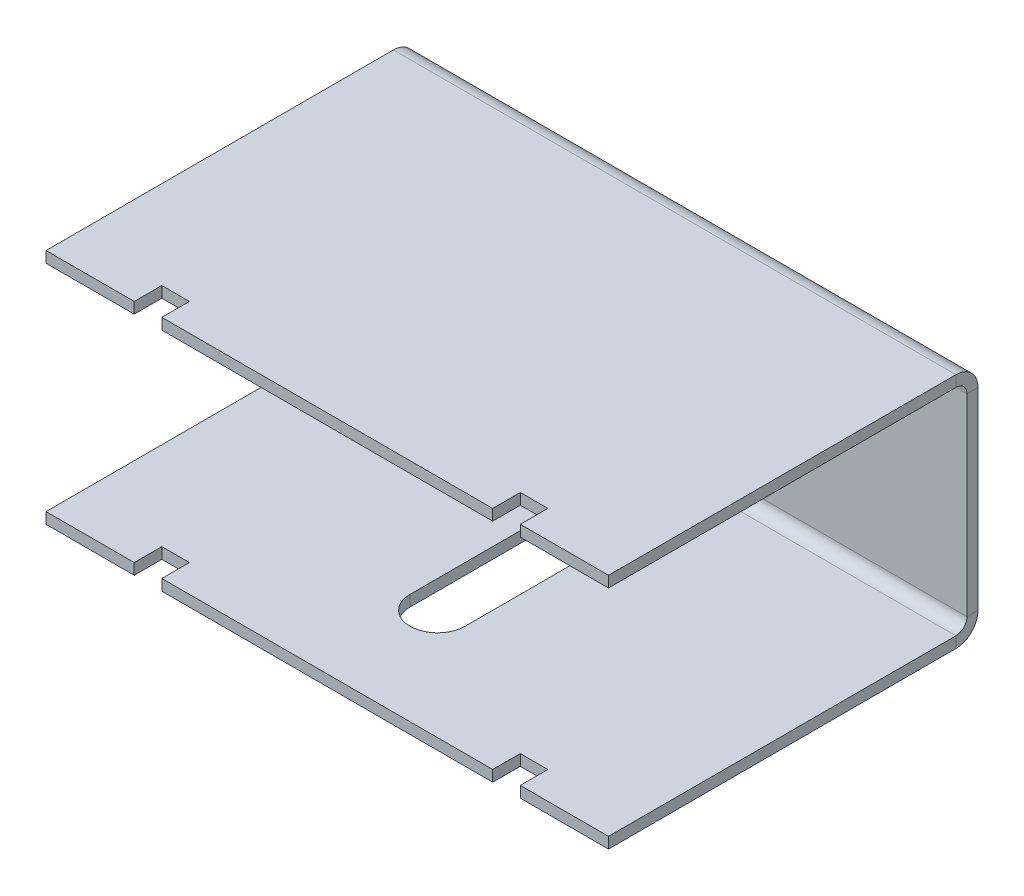
ISO-10303-21;
HEADER;
FILE_DESCRIPTION(('STEP AP214'),'2;1');
FILE_NAME('part.step','',(''),(''),'','','');
FILE_SCHEMA(('AUTOMOTIVE_DESIGN { 1 0 10303 214 1 1 1 1 }'));
ENDSEC;
DATA;
#1=APPLICATION_CONTEXT('core data for automotive mechanical design processes');
#2=APPLICATION_PROTOCOL_DEFINITION('international standard','automotive_design',2000,#1);
#3=PRODUCT_CONTEXT('',#1,'mechanical');
#4=PRODUCT('Part','Part','',(#3));
#5=PRODUCT_RELATED_PRODUCT_CATEGORY('part','',(#4));
#6=PRODUCT_DEFINITION_FORMATION('','',#4);
#7=PRODUCT_DEFINITION_CONTEXT('part definition',#1,'design');
#8=PRODUCT_DEFINITION('design','',#6,#7);
#9=PRODUCT_DEFINITION_SHAPE('','',#8);
#10=(LENGTH_UNIT() NAMED_UNIT(*) SI_UNIT(.MILLI.,.METRE.));
#11=(NAMED_UNIT(*) PLANE_ANGLE_UNIT() SI_UNIT($,.RADIAN.));
#12=(NAMED_UNIT(*) SI_UNIT($,.STERADIAN.) SOLID_ANGLE_UNIT());
#13=UNCERTAINTY_MEASURE_WITH_UNIT(LENGTH_MEASURE(1.E-05),#10,'distance_accuracy_value','');
#14=(GEOMETRIC_REPRESENTATION_CONTEXT(3) GLOBAL_UNCERTAINTY_ASSIGNED_CONTEXT((#13)) GLOBAL_UNIT_ASSIGNED_CONTEXT((#10,
#11,#12)) REPRESENTATION_CONTEXT('',''));
#15=CARTESIAN_POINT('',(0.,0.,0.));
#16=DIRECTION('',(0.,0.,1.));
#17=DIRECTION('',(1.,0.,0.));
#18=AXIS2_PLACEMENT_3D('',#15,#16,#17);
#19=CARTESIAN_POINT('',(51.,-21.5,32.5));
#20=DIRECTION('',(0.,0.,1.));
#21=DIRECTION('',(1.,0.,0.));
#22=AXIS2_PLACEMENT_3D('',#19,#20,#21);
#23=PLANE('',#22);
#24=DIRECTION('',(0.,1.,0.));
#25=VECTOR('',#24,1.);
#26=CARTESIAN_POINT('',(35.,-21.5,32.5));
#27=LINE('',#26,#25);
#28=CARTESIAN_POINT('',(35.,-21.5,32.5));
#29=VERTEX_POINT('',#28);
#30=CARTESIAN_POINT('',(35.,-19.5,32.5));
#31=VERTEX_POINT('',#30);
#32=EDGE_CURVE('E305',#29,#31,#27,.T.);
#33=ORIENTED_EDGE('',*,*,#32,.F.);
#34=DIRECTION('',(-1.,0.,0.));
#35=VECTOR('',#34,1.);
#36=CARTESIAN_POINT('',(51.,-21.5,32.5));
#37=LINE('',#36,#35);
#38=CARTESIAN_POINT('',(51.,-21.5,32.5));
#39=VERTEX_POINT('',#38);
#40=EDGE_CURVE('E282',#39,#29,#37,.T.);
#41=ORIENTED_EDGE('',*,*,#40,.F.);
#42=DIRECTION('',(0.,1.,0.));
#43=VECTOR('',#42,1.);
#44=CARTESIAN_POINT('',(51.,-21.5,32.5));
#45=LINE('',#44,#43);
#46=CARTESIAN_POINT('',(51.,-19.5,32.5));
#47=VERTEX_POINT('',#46);
#48=EDGE_CURVE('E384',#39,#47,#45,.T.);
#49=ORIENTED_EDGE('',*,*,#48,.T.);
#50=DIRECTION('',(-1.,0.,0.));
#51=VECTOR('',#50,1.);
#52=CARTESIAN_POINT('',(51.,-19.5,32.5));
#53=LINE('',#52,#51);
#54=EDGE_CURVE('E489',#47,#31,#53,.T.);
#55=ORIENTED_EDGE('',*,*,#54,.T.);
#56=EDGE_LOOP('',(#33,#41,#49,#55));
#57=FACE_BOUND('',#56,.T.);
#58=ADVANCED_FACE('F51',(#57),#23,.T.);
#59=CARTESIAN_POINT('',(51.,19.5,32.5));
#60=DIRECTION('',(0.,0.,1.));
#61=DIRECTION('',(1.,0.,0.));
#62=AXIS2_PLACEMENT_3D('',#59,#60,#61);
#63=PLANE('',#62);
#64=DIRECTION('',(0.,1.,0.));
#65=VECTOR('',#64,1.);
#66=CARTESIAN_POINT('',(35.,19.5,32.5));
#67=LINE('',#66,#65);
#68=CARTESIAN_POINT('',(35.,19.5,32.5));
#69=VERTEX_POINT('',#68);
#70=CARTESIAN_POINT('',(35.,21.5,32.5));
#71=VERTEX_POINT('',#70);
#72=EDGE_CURVE('E302',#69,#71,#67,.T.);
#73=ORIENTED_EDGE('',*,*,#72,.F.);
#74=DIRECTION('',(-1.,0.,0.));
#75=VECTOR('',#74,1.);
#76=CARTESIAN_POINT('',(51.,19.5,32.5));
#77=LINE('',#76,#75);
#78=CARTESIAN_POINT('',(51.,19.5,32.5));
#79=VERTEX_POINT('',#78);
#80=EDGE_CURVE('E464',#79,#69,#77,.T.);
#81=ORIENTED_EDGE('',*,*,#80,.F.);
#82=DIRECTION('',(0.,1.,0.));
#83=VECTOR('',#82,1.);
#84=CARTESIAN_POINT('',(51.,19.5,32.5));
#85=LINE('',#84,#83);
#86=CARTESIAN_POINT('',(51.,21.5,32.5));
#87=VERTEX_POINT('',#86);
#88=EDGE_CURVE('E402',#79,#87,#85,.T.);
#89=ORIENTED_EDGE('',*,*,#88,.T.);
#90=DIRECTION('',(-1.,0.,0.));
#91=VECTOR('',#90,1.);
#92=CARTESIAN_POINT('',(51.,21.5,32.5));
#93=LINE('',#92,#91);
#94=EDGE_CURVE('E469',#87,#71,#93,.T.);
#95=ORIENTED_EDGE('',*,*,#94,.T.);
#96=EDGE_LOOP('',(#73,#81,#89,#95));
#97=FACE_BOUND('',#96,.T.);
#98=ADVANCED_FACE('F611',(#97),#63,.T.);
#99=DIRECTION('',(0.,-1.,0.));
#100=VECTOR('',#99,1.);
#101=CARTESIAN_POINT('',(30.,-21.5,32.5));
#102=LINE('',#101,#100);
#103=CARTESIAN_POINT('',(30.,-19.5,32.5));
#104=VERTEX_POINT('',#103);
#105=CARTESIAN_POINT('',(30.,-21.5,32.5));
#106=VERTEX_POINT('',#105);
#107=EDGE_CURVE('E300',#104,#106,#102,.T.);
#108=ORIENTED_EDGE('',*,*,#107,.F.);
#109=CARTESIAN_POINT('',(-30.,-19.5,32.5));
#110=VERTEX_POINT('',#109);
#111=EDGE_CURVE('E493',#104,#110,#53,.T.);
#112=ORIENTED_EDGE('',*,*,#111,.T.);
#113=DIRECTION('',(0.,1.,0.));
#114=VECTOR('',#113,1.);
#115=CARTESIAN_POINT('',(-30.,-21.5,32.5));
#116=LINE('',#115,#114);
#117=CARTESIAN_POINT('',(-30.,-21.5,32.5));
#118=VERTEX_POINT('',#117);
#119=EDGE_CURVE('E344',#118,#110,#116,.T.);
#120=ORIENTED_EDGE('',*,*,#119,.F.);
#121=EDGE_CURVE('E488',#106,#118,#37,.T.);
#122=ORIENTED_EDGE('',*,*,#121,.F.);
#123=EDGE_LOOP('',(#108,#112,#120,#122));
#124=FACE_BOUND('',#123,.T.);
#125=ADVANCED_FACE('F638',(#124),#23,.T.);
#126=DIRECTION('',(0.,-1.,0.));
#127=VECTOR('',#126,1.);
#128=CARTESIAN_POINT('',(30.,19.5,32.5));
#129=LINE('',#128,#127);
#130=CARTESIAN_POINT('',(30.,21.5,32.5));
#131=VERTEX_POINT('',#130);
#132=CARTESIAN_POINT('',(30.,19.5,32.5));
#133=VERTEX_POINT('',#132);
#134=EDGE_CURVE('E295',#131,#133,#129,.T.);
#135=ORIENTED_EDGE('',*,*,#134,.F.);
#136=CARTESIAN_POINT('',(-30.,21.5,32.5));
#137=VERTEX_POINT('',#136);
#138=EDGE_CURVE('E473',#131,#137,#93,.T.);
#139=ORIENTED_EDGE('',*,*,#138,.T.);
#140=DIRECTION('',(0.,1.,0.));
#141=VECTOR('',#140,1.);
#142=CARTESIAN_POINT('',(-30.,19.5,32.5));
#143=LINE('',#142,#141);
#144=CARTESIAN_POINT('',(-30.,19.5,32.5));
#145=VERTEX_POINT('',#144);
#146=EDGE_CURVE('E341',#145,#137,#143,.T.);
#147=ORIENTED_EDGE('',*,*,#146,.F.);
#148=EDGE_CURVE('E468',#133,#145,#77,.T.);
#149=ORIENTED_EDGE('',*,*,#148,.F.);
#150=EDGE_LOOP('',(#135,#139,#147,#149));
#151=FACE_BOUND('',#150,.T.);
#152=ADVANCED_FACE('F529',(#151),#63,.T.);
#153=CARTESIAN_POINT('',(51.,-17.5,-32.5));
#154=DIRECTION('',(1.,0.,0.));
#155=DIRECTION('',(0.,0.,-1.));
#156=AXIS2_PLACEMENT_3D('',#153,#154,#155);
#157=PLANE('',#156);
#158=DIRECTION('',(0.,0.,-1.));
#159=VECTOR('',#158,1.);
#160=CARTESIAN_POINT('',(51.,-17.5,-32.5));
#161=LINE('',#160,#159);
#162=CARTESIAN_POINT('',(51.,-17.5,-32.5));
#163=VERTEX_POINT('',#162);
#164=CARTESIAN_POINT('',(51.,-17.5,-34.5));
#165=VERTEX_POINT('',#164);
#166=EDGE_CURVE('E507',#163,#165,#161,.T.);
#167=ORIENTED_EDGE('',*,*,#166,.F.);
#168=CARTESIAN_POINT('',(51.,-17.5,-30.5));
#169=DIRECTION('',(-1.,0.,0.));
#170=DIRECTION('',(0.,0.,1.));
#171=AXIS2_PLACEMENT_3D('',#168,#169,#170);
#172=CIRCLE('',#171,2.);
#173=CARTESIAN_POINT('',(51.,-19.5,-30.5));
#174=VERTEX_POINT('',#173);
#175=EDGE_CURVE('E414',#163,#174,#172,.T.);
#176=ORIENTED_EDGE('',*,*,#175,.T.);
#177=DIRECTION('',(0.,1.,0.));
#178=VECTOR('',#177,1.);
#179=CARTESIAN_POINT('',(51.,-21.5,-30.5));
#180=LINE('',#179,#178);
#181=CARTESIAN_POINT('',(51.,-21.5,-30.5));
#182=VERTEX_POINT('',#181);
#183=EDGE_CURVE('E505',#182,#174,#180,.T.);
#184=ORIENTED_EDGE('',*,*,#183,.F.);
#185=CARTESIAN_POINT('',(51.,-17.5,-30.5));
#186=DIRECTION('',(1.,0.,0.));
#187=DIRECTION('',(0.,0.,-1.));
#188=AXIS2_PLACEMENT_3D('',#185,#186,#187);
#189=CIRCLE('',#188,4.);
#190=EDGE_CURVE('E390',#165,#182,#189,.F.);
#191=ORIENTED_EDGE('',*,*,#190,.F.);
#192=EDGE_LOOP('',(#167,#176,#184,#191));
#193=FACE_BOUND('',#192,.T.);
#194=ADVANCED_FACE('F53',(#193),#157,.T.);
#195=CARTESIAN_POINT('',(51.,-21.5,-30.5));
#196=DIRECTION('',(1.,0.,0.));
#197=DIRECTION('',(0.,0.,-1.));
#198=AXIS2_PLACEMENT_3D('',#195,#196,#197);
#199=PLANE('',#198);
#200=DIRECTION('',(0.,-1.,0.));
#201=VECTOR('',#200,1.);
#202=CARTESIAN_POINT('',(51.,-19.5,-32.5));
#203=LINE('',#202,#201);
#204=CARTESIAN_POINT('',(51.,17.5,-32.5));
#205=VERTEX_POINT('',#204);
#206=EDGE_CURVE('E411',#205,#163,#203,.T.);
#207=ORIENTED_EDGE('',*,*,#206,.T.);
#208=ORIENTED_EDGE('',*,*,#166,.T.);
#209=DIRECTION('',(0.,1.,0.));
#210=VECTOR('',#209,1.);
#211=CARTESIAN_POINT('',(51.,-19.5,-34.5));
#212=LINE('',#211,#210);
#213=CARTESIAN_POINT('',(51.,17.5,-34.5));
#214=VERTEX_POINT('',#213);
#215=EDGE_CURVE('E393',#214,#165,#212,.F.);
#216=ORIENTED_EDGE('',*,*,#215,.F.);
#217=DIRECTION('',(0.,0.,1.));
#218=VECTOR('',#217,1.);
#219=CARTESIAN_POINT('',(51.,17.5,-34.5));
#220=LINE('',#219,#218);
#221=EDGE_CURVE('E497',#214,#205,#220,.T.);
#222=ORIENTED_EDGE('',*,*,#221,.T.);
#223=EDGE_LOOP('',(#207,#208,#216,#222));
#224=FACE_BOUND('',#223,.T.);
#225=ADVANCED_FACE('F602',(#224),#199,.T.);
#226=CARTESIAN_POINT('',(-51.,-19.5,-30.5));
#227=DIRECTION('',(-1.,0.,0.));
#228=DIRECTION('',(0.,0.,1.));
#229=AXIS2_PLACEMENT_3D('',#226,#227,#228);
#230=PLANE('',#229);
#231=DIRECTION('',(0.,-1.,0.));
#232=VECTOR('',#231,1.);
#233=CARTESIAN_POINT('',(-51.,-19.5,-30.5));
#234=LINE('',#233,#232);
#235=CARTESIAN_POINT('',(-51.,-19.5,-30.5));
#236=VERTEX_POINT('',#235);
#237=CARTESIAN_POINT('',(-51.,-21.5,-30.5));
#238=VERTEX_POINT('',#237);
#239=EDGE_CURVE('E503',#236,#238,#234,.T.);
#240=ORIENTED_EDGE('',*,*,#239,.F.);
#241=CARTESIAN_POINT('',(-51.,-17.5,-30.5));
#242=DIRECTION('',(-1.,0.,0.));
#243=DIRECTION('',(0.,0.,1.));
#244=AXIS2_PLACEMENT_3D('',#241,#242,#243);
#245=CIRCLE('',#244,2.);
#246=CARTESIAN_POINT('',(-51.,-17.5,-32.5));
#247=VERTEX_POINT('',#246);
#248=EDGE_CURVE('E385',#247,#236,#245,.T.);
#249=ORIENTED_EDGE('',*,*,#248,.F.);
#250=DIRECTION('',(0.,0.,1.));
#251=VECTOR('',#250,1.);
#252=CARTESIAN_POINT('',(-51.,-17.5,-34.5));
#253=LINE('',#252,#251);
#254=CARTESIAN_POINT('',(-51.,-17.5,-34.5));
#255=VERTEX_POINT('',#254);
#256=EDGE_CURVE('E501',#255,#247,#253,.T.);
#257=ORIENTED_EDGE('',*,*,#256,.F.);
#258=CARTESIAN_POINT('',(-51.,-17.5,-30.5));
#259=DIRECTION('',(1.,0.,0.));
#260=DIRECTION('',(0.,0.,-1.));
#261=AXIS2_PLACEMENT_3D('',#258,#259,#260);
#262=CIRCLE('',#261,4.);
#263=EDGE_CURVE('E426',#255,#238,#262,.F.);
#264=ORIENTED_EDGE('',*,*,#263,.T.);
#265=EDGE_LOOP('',(#240,#249,#257,#264));
#266=FACE_BOUND('',#265,.T.);
#267=ADVANCED_FACE('F571',(#266),#230,.T.);
#268=CARTESIAN_POINT('',(-51.,-17.5,-34.5));
#269=DIRECTION('',(-1.,0.,0.));
#270=DIRECTION('',(0.,0.,1.));
#271=AXIS2_PLACEMENT_3D('',#268,#269,#270);
#272=PLANE('',#271);
#273=DIRECTION('',(0.,0.,1.));
#274=VECTOR('',#273,1.);
#275=CARTESIAN_POINT('',(-51.,-19.5,32.5));
#276=LINE('',#275,#274);
#277=CARTESIAN_POINT('',(-51.,-19.5,32.5));
#278=VERTEX_POINT('',#277);
#279=EDGE_CURVE('E374',#236,#278,#276,.T.);
#280=ORIENTED_EDGE('',*,*,#279,.F.);
#281=ORIENTED_EDGE('',*,*,#239,.T.);
#282=DIRECTION('',(0.,0.,-1.));
#283=VECTOR('',#282,1.);
#284=CARTESIAN_POINT('',(-51.,-21.5,32.5));
#285=LINE('',#284,#283);
#286=CARTESIAN_POINT('',(-51.,-21.5,32.5));
#287=VERTEX_POINT('',#286);
#288=EDGE_CURVE('E423',#238,#287,#285,.F.);
#289=ORIENTED_EDGE('',*,*,#288,.T.);
#290=DIRECTION('',(0.,1.,0.));
#291=VECTOR('',#290,1.);
#292=CARTESIAN_POINT('',(-51.,-21.5,32.5));
#293=LINE('',#292,#291);
#294=EDGE_CURVE('E420',#287,#278,#293,.T.);
#295=ORIENTED_EDGE('',*,*,#294,.T.);
#296=EDGE_LOOP('',(#280,#281,#289,#295));
#297=FACE_BOUND('',#296,.T.);
#298=ADVANCED_FACE('F587',(#297),#272,.T.);
#299=CARTESIAN_POINT('',(51.,19.5,-30.5));
#300=DIRECTION('',(1.,0.,0.));
#301=DIRECTION('',(0.,0.,-1.));
#302=AXIS2_PLACEMENT_3D('',#299,#300,#301);
#303=PLANE('',#302);
#304=DIRECTION('',(0.,1.,0.));
#305=VECTOR('',#304,1.);
#306=CARTESIAN_POINT('',(51.,19.5,-30.5));
#307=LINE('',#306,#305);
#308=CARTESIAN_POINT('',(51.,19.5,-30.5));
#309=VERTEX_POINT('',#308);
#310=CARTESIAN_POINT('',(51.,21.5,-30.5));
#311=VERTEX_POINT('',#310);
#312=EDGE_CURVE('E499',#309,#311,#307,.T.);
#313=ORIENTED_EDGE('',*,*,#312,.F.);
#314=CARTESIAN_POINT('',(51.,17.5,-30.5));
#315=DIRECTION('',(-1.,0.,0.));
#316=DIRECTION('',(0.,0.,1.));
#317=AXIS2_PLACEMENT_3D('',#314,#315,#316);
#318=CIRCLE('',#317,2.);
#319=EDGE_CURVE('E408',#309,#205,#318,.T.);
#320=ORIENTED_EDGE('',*,*,#319,.T.);
#321=ORIENTED_EDGE('',*,*,#221,.F.);
#322=CARTESIAN_POINT('',(51.,17.5,-30.5));
#323=DIRECTION('',(1.,0.,0.));
#324=DIRECTION('',(0.,0.,-1.));
#325=AXIS2_PLACEMENT_3D('',#322,#323,#324);
#326=CIRCLE('',#325,4.);
#327=EDGE_CURVE('E396',#311,#214,#326,.F.);
#328=ORIENTED_EDGE('',*,*,#327,.F.);
#329=EDGE_LOOP('',(#313,#320,#321,#328));
#330=FACE_BOUND('',#329,.T.);
#331=ADVANCED_FACE('F604',(#330),#303,.T.);
#332=CARTESIAN_POINT('',(51.,17.5,-34.5));
#333=DIRECTION('',(1.,0.,0.));
#334=DIRECTION('',(0.,0.,-1.));
#335=AXIS2_PLACEMENT_3D('',#332,#333,#334);
#336=PLANE('',#335);
#337=DIRECTION('',(0.,0.,-1.));
#338=VECTOR('',#337,1.);
#339=CARTESIAN_POINT('',(51.,19.5,32.5));
#340=LINE('',#339,#338);
#341=EDGE_CURVE('E405',#79,#309,#340,.T.);
#342=ORIENTED_EDGE('',*,*,#341,.T.);
#343=ORIENTED_EDGE('',*,*,#312,.T.);
#344=DIRECTION('',(0.,0.,-1.));
#345=VECTOR('',#344,1.);
#346=CARTESIAN_POINT('',(51.,21.5,32.5));
#347=LINE('',#346,#345);
#348=EDGE_CURVE('E399',#87,#311,#347,.T.);
#349=ORIENTED_EDGE('',*,*,#348,.F.);
#350=ORIENTED_EDGE('',*,*,#88,.F.);
#351=EDGE_LOOP('',(#342,#343,#349,#350));
#352=FACE_BOUND('',#351,.T.);
#353=ADVANCED_FACE('F608',(#352),#336,.T.);
#354=CARTESIAN_POINT('',(-51.,17.5,-32.5));
#355=DIRECTION('',(-1.,0.,0.));
#356=DIRECTION('',(0.,0.,1.));
#357=AXIS2_PLACEMENT_3D('',#354,#355,#356);
#358=PLANE('',#357);
#359=DIRECTION('',(0.,0.,-1.));
#360=VECTOR('',#359,1.);
#361=CARTESIAN_POINT('',(-51.,17.5,-32.5));
#362=LINE('',#361,#360);
#363=CARTESIAN_POINT('',(-51.,17.5,-32.5));
#364=VERTEX_POINT('',#363);
#365=CARTESIAN_POINT('',(-51.,17.5,-34.5));
#366=VERTEX_POINT('',#365);
#367=EDGE_CURVE('E495',#364,#366,#362,.T.);
#368=ORIENTED_EDGE('',*,*,#367,.F.);
#369=CARTESIAN_POINT('',(-51.,17.5,-30.5));
#370=DIRECTION('',(-1.,0.,0.));
#371=DIRECTION('',(0.,0.,1.));
#372=AXIS2_PLACEMENT_3D('',#369,#370,#371);
#373=CIRCLE('',#372,2.);
#374=CARTESIAN_POINT('',(-51.,19.5,-30.5));
#375=VERTEX_POINT('',#374);
#376=EDGE_CURVE('E444',#375,#364,#373,.T.);
#377=ORIENTED_EDGE('',*,*,#376,.F.);
#378=DIRECTION('',(0.,-1.,0.));
#379=VECTOR('',#378,1.);
#380=CARTESIAN_POINT('',(-51.,21.5,-30.5));
#381=LINE('',#380,#379);
#382=CARTESIAN_POINT('',(-51.,21.5,-30.5));
#383=VERTEX_POINT('',#382);
#384=EDGE_CURVE('E492',#383,#375,#381,.T.);
#385=ORIENTED_EDGE('',*,*,#384,.F.);
#386=CARTESIAN_POINT('',(-51.,17.5,-30.5));
#387=DIRECTION('',(1.,0.,0.));
#388=DIRECTION('',(0.,0.,-1.));
#389=AXIS2_PLACEMENT_3D('',#386,#387,#388);
#390=CIRCLE('',#389,4.);
#391=EDGE_CURVE('E432',#383,#366,#390,.F.);
#392=ORIENTED_EDGE('',*,*,#391,.T.);
#393=EDGE_LOOP('',(#368,#377,#385,#392));
#394=FACE_BOUND('',#393,.T.);
#395=ADVANCED_FACE('F556',(#394),#358,.T.);
#396=CARTESIAN_POINT('',(-51.,21.5,-30.5));
#397=DIRECTION('',(-1.,0.,0.));
#398=DIRECTION('',(0.,0.,1.));
#399=AXIS2_PLACEMENT_3D('',#396,#397,#398);
#400=PLANE('',#399);
#401=DIRECTION('',(0.,-1.,0.));
#402=VECTOR('',#401,1.);
#403=CARTESIAN_POINT('',(-51.,-19.5,-32.5));
#404=LINE('',#403,#402);
#405=EDGE_CURVE('E447',#364,#247,#404,.T.);
#406=ORIENTED_EDGE('',*,*,#405,.F.);
#407=ORIENTED_EDGE('',*,*,#367,.T.);
#408=DIRECTION('',(0.,1.,0.));
#409=VECTOR('',#408,1.);
#410=CARTESIAN_POINT('',(-51.,-19.5,-34.5));
#411=LINE('',#410,#409);
#412=EDGE_CURVE('E429',#366,#255,#411,.F.);
#413=ORIENTED_EDGE('',*,*,#412,.T.);
#414=ORIENTED_EDGE('',*,*,#256,.T.);
#415=EDGE_LOOP('',(#406,#407,#413,#414));
#416=FACE_BOUND('',#415,.T.);
#417=ADVANCED_FACE('F568',(#416),#400,.T.);
#418=CARTESIAN_POINT('',(51.,-19.5,32.5));
#419=DIRECTION('',(0.,-1.,0.));
#420=DIRECTION('',(0.,0.,-1.));
#421=AXIS2_PLACEMENT_3D('',#418,#419,#420);
#422=PLANE('',#421);
#423=DIRECTION('',(0.,0.,-1.));
#424=VECTOR('',#423,1.);
#425=CARTESIAN_POINT('',(5.,-19.5,12.5));
#426=LINE('',#425,#424);
#427=CARTESIAN_POINT('',(5.,-19.5,12.5));
#428=VERTEX_POINT('',#427);
#429=CARTESIAN_POINT('',(5.,-19.5,-14.5));
#430=VERTEX_POINT('',#429);
#431=EDGE_CURVE('E369',#428,#430,#426,.T.);
#432=ORIENTED_EDGE('',*,*,#431,.F.);
#433=CARTESIAN_POINT('',(0.,-19.5,12.5));
#434=DIRECTION('',(0.,-1.,0.));
#435=DIRECTION('',(0.,0.,-1.));
#436=AXIS2_PLACEMENT_3D('',#433,#434,#435);
#437=CIRCLE('',#436,5.);
#438=CARTESIAN_POINT('',(-5.,-19.5,12.5));
#439=VERTEX_POINT('',#438);
#440=EDGE_CURVE('E354',#439,#428,#437,.F.);
#441=ORIENTED_EDGE('',*,*,#440,.F.);
#442=DIRECTION('',(0.,0.,1.));
#443=VECTOR('',#442,1.);
#444=CARTESIAN_POINT('',(-5.,-19.5,12.5));
#445=LINE('',#444,#443);
#446=CARTESIAN_POINT('',(-4.99999999999999,-19.5,-14.5));
#447=VERTEX_POINT('',#446);
#448=EDGE_CURVE('E351',#447,#439,#445,.T.);
#449=ORIENTED_EDGE('',*,*,#448,.F.);
#450=CARTESIAN_POINT('',(0.,-19.5,-14.5));
#451=DIRECTION('',(0.,-1.,0.));
#452=DIRECTION('',(0.,0.,-1.));
#453=AXIS2_PLACEMENT_3D('',#450,#451,#452);
#454=CIRCLE('',#453,5.);
#455=EDGE_CURVE('E372',#430,#447,#454,.F.);
#456=ORIENTED_EDGE('',*,*,#455,.F.);
#457=EDGE_LOOP('',(#432,#441,#449,#456));
#458=FACE_BOUND('',#457,.T.);
#459=DIRECTION('',(1.,0.,0.));
#460=VECTOR('',#459,1.);
#461=CARTESIAN_POINT('',(51.,-19.5,27.5));
#462=LINE('',#461,#460);
#463=CARTESIAN_POINT('',(30.,-19.5,27.5));
#464=VERTEX_POINT('',#463);
#465=CARTESIAN_POINT('',(35.,-19.5,27.5));
#466=VERTEX_POINT('',#465);
#467=EDGE_CURVE('E292',#464,#466,#462,.T.);
#468=ORIENTED_EDGE('',*,*,#467,.T.);
#469=DIRECTION('',(0.,0.,1.));
#470=VECTOR('',#469,1.);
#471=CARTESIAN_POINT('',(35.,-19.5,32.5));
#472=LINE('',#471,#470);
#473=EDGE_CURVE('E267',#466,#31,#472,.T.);
#474=ORIENTED_EDGE('',*,*,#473,.T.);
#475=ORIENTED_EDGE('',*,*,#54,.F.);
#476=DIRECTION('',(0.,0.,1.));
#477=VECTOR('',#476,1.);
#478=CARTESIAN_POINT('',(51.,-19.5,32.5));
#479=LINE('',#478,#477);
#480=EDGE_CURVE('E382',#174,#47,#479,.T.);
#481=ORIENTED_EDGE('',*,*,#480,.F.);
#482=DIRECTION('',(-1.,0.,0.));
#483=VECTOR('',#482,1.);
#484=CARTESIAN_POINT('',(51.,-19.5,-30.5));
#485=LINE('',#484,#483);
#486=EDGE_CURVE('E417',#174,#236,#485,.T.);
#487=ORIENTED_EDGE('',*,*,#486,.T.);
#488=ORIENTED_EDGE('',*,*,#279,.T.);
#489=CARTESIAN_POINT('',(-35.,-19.5,32.5));
#490=VERTEX_POINT('',#489);
#491=EDGE_CURVE('E487',#490,#278,#53,.T.);
#492=ORIENTED_EDGE('',*,*,#491,.F.);
#493=DIRECTION('',(0.,0.,-1.));
#494=VECTOR('',#493,1.);
#495=CARTESIAN_POINT('',(-35.,-19.5,32.5));
#496=LINE('',#495,#494);
#497=CARTESIAN_POINT('',(-35.,-19.5,27.5));
#498=VERTEX_POINT('',#497);
#499=EDGE_CURVE('E338',#490,#498,#496,.T.);
#500=ORIENTED_EDGE('',*,*,#499,.T.);
#501=DIRECTION('',(1.,0.,0.));
#502=VECTOR('',#501,1.);
#503=CARTESIAN_POINT('',(51.,-19.5,27.5));
#504=LINE('',#503,#502);
#505=CARTESIAN_POINT('',(-30.,-19.5,27.5));
#506=VERTEX_POINT('',#505);
#507=EDGE_CURVE('E327',#498,#506,#504,.T.);
#508=ORIENTED_EDGE('',*,*,#507,.T.);
#509=DIRECTION('',(0.,0.,1.));
#510=VECTOR('',#509,1.);
#511=CARTESIAN_POINT('',(-30.,-19.5,32.5));
#512=LINE('',#511,#510);
#513=EDGE_CURVE('E347',#506,#110,#512,.T.);
#514=ORIENTED_EDGE('',*,*,#513,.T.);
#515=ORIENTED_EDGE('',*,*,#111,.F.);
#516=DIRECTION('',(0.,0.,-1.));
#517=VECTOR('',#516,1.);
#518=CARTESIAN_POINT('',(30.,-19.5,32.5));
#519=LINE('',#518,#517);
#520=EDGE_CURVE('E297',#104,#464,#519,.T.);
#521=ORIENTED_EDGE('',*,*,#520,.T.);
#522=EDGE_LOOP('',(#468,#474,#475,#481,#487,#488,#492,#500,#508,#514,#515,#521));
#523=FACE_BOUND('',#522,.T.);
#524=ADVANCED_FACE('F594',(#458,#523),#422,.F.);
#525=DIRECTION('',(0.,-1.,0.));
#526=VECTOR('',#525,1.);
#527=CARTESIAN_POINT('',(-35.,-21.5,32.5));
#528=LINE('',#527,#526);
#529=CARTESIAN_POINT('',(-35.,-21.5,32.5));
#530=VERTEX_POINT('',#529);
#531=EDGE_CURVE('E336',#490,#530,#528,.T.);
#532=ORIENTED_EDGE('',*,*,#531,.F.);
#533=ORIENTED_EDGE('',*,*,#491,.T.);
#534=ORIENTED_EDGE('',*,*,#294,.F.);
#535=EDGE_CURVE('E485',#530,#287,#37,.T.);
#536=ORIENTED_EDGE('',*,*,#535,.F.);
#537=EDGE_LOOP('',(#532,#533,#534,#536));
#538=FACE_BOUND('',#537,.T.);
#539=ADVANCED_FACE('F639',(#538),#23,.T.);
#540=CARTESIAN_POINT('',(51.,-21.5,32.5));
#541=DIRECTION('',(0.,-1.,0.));
#542=DIRECTION('',(0.,0.,-1.));
#543=AXIS2_PLACEMENT_3D('',#540,#541,#542);
#544=PLANE('',#543);
#545=DIRECTION('',(0.,0.,-1.));
#546=VECTOR('',#545,1.);
#547=CARTESIAN_POINT('',(35.,-21.5,37.5));
#548=LINE('',#547,#546);
#549=CARTESIAN_POINT('',(35.,-21.5,27.5));
#550=VERTEX_POINT('',#549);
#551=EDGE_CURVE('E264',#29,#550,#548,.T.);
#552=ORIENTED_EDGE('',*,*,#551,.T.);
#553=DIRECTION('',(-1.,0.,0.));
#554=VECTOR('',#553,1.);
#555=CARTESIAN_POINT('',(35.,-21.5,27.5));
#556=LINE('',#555,#554);
#557=CARTESIAN_POINT('',(30.,-21.5,27.5));
#558=VERTEX_POINT('',#557);
#559=EDGE_CURVE('E273',#550,#558,#556,.T.);
#560=ORIENTED_EDGE('',*,*,#559,.T.);
#561=DIRECTION('',(0.,0.,1.));
#562=VECTOR('',#561,1.);
#563=CARTESIAN_POINT('',(30.,-21.5,37.5));
#564=LINE('',#563,#562);
#565=EDGE_CURVE('E66',#558,#106,#564,.T.);
#566=ORIENTED_EDGE('',*,*,#565,.T.);
#567=ORIENTED_EDGE('',*,*,#121,.T.);
#568=DIRECTION('',(0.,0.,-1.));
#569=VECTOR('',#568,1.);
#570=CARTESIAN_POINT('',(-30.,-21.5,37.5));
#571=LINE('',#570,#569);
#572=CARTESIAN_POINT('',(-30.,-21.5,27.5));
#573=VERTEX_POINT('',#572);
#574=EDGE_CURVE('E308',#118,#573,#571,.T.);
#575=ORIENTED_EDGE('',*,*,#574,.T.);
#576=DIRECTION('',(-1.,0.,0.));
#577=VECTOR('',#576,1.);
#578=CARTESIAN_POINT('',(-35.,-21.5,27.5));
#579=LINE('',#578,#577);
#580=CARTESIAN_POINT('',(-35.,-21.5,27.5));
#581=VERTEX_POINT('',#580);
#582=EDGE_CURVE('E311',#573,#581,#579,.T.);
#583=ORIENTED_EDGE('',*,*,#582,.T.);
#584=DIRECTION('',(0.,0.,1.));
#585=VECTOR('',#584,1.);
#586=CARTESIAN_POINT('',(-35.,-21.5,37.5));
#587=LINE('',#586,#585);
#588=EDGE_CURVE('E315',#581,#530,#587,.T.);
#589=ORIENTED_EDGE('',*,*,#588,.T.);
#590=ORIENTED_EDGE('',*,*,#535,.T.);
#591=ORIENTED_EDGE('',*,*,#288,.F.);
#592=DIRECTION('',(-1.,0.,0.));
#593=VECTOR('',#592,1.);
#594=CARTESIAN_POINT('',(51.,-21.5,-30.5));
#595=LINE('',#594,#593);
#596=EDGE_CURVE('E482',#182,#238,#595,.T.);
#597=ORIENTED_EDGE('',*,*,#596,.F.);
#598=DIRECTION('',(0.,0.,-1.));
#599=VECTOR('',#598,1.);
#600=CARTESIAN_POINT('',(51.,-21.5,32.5));
#601=LINE('',#600,#599);
#602=EDGE_CURVE('E388',#182,#39,#601,.F.);
#603=ORIENTED_EDGE('',*,*,#602,.T.);
#604=ORIENTED_EDGE('',*,*,#40,.T.);
#605=EDGE_LOOP('',(#552,#560,#566,#567,#575,#583,#589,#590,#591,#597,#603,#604));
#606=FACE_BOUND('',#605,.T.);
#607=CARTESIAN_POINT('',(0.,-21.5,12.5));
#608=DIRECTION('',(0.,-1.,0.));
#609=DIRECTION('',(0.,0.,-1.));
#610=AXIS2_PLACEMENT_3D('',#607,#608,#609);
#611=CIRCLE('',#610,5.);
#612=CARTESIAN_POINT('',(5.,-21.5,12.5));
#613=VERTEX_POINT('',#612);
#614=CARTESIAN_POINT('',(-4.99999999999999,-21.5,12.5));
#615=VERTEX_POINT('',#614);
#616=EDGE_CURVE('E364',#613,#615,#611,.T.);
#617=ORIENTED_EDGE('',*,*,#616,.F.);
#618=DIRECTION('',(0.,0.,1.));
#619=VECTOR('',#618,1.);
#620=CARTESIAN_POINT('',(5.,-21.5,12.5));
#621=LINE('',#620,#619);
#622=CARTESIAN_POINT('',(5.,-21.5,-14.5));
#623=VERTEX_POINT('',#622);
#624=EDGE_CURVE('E355',#623,#613,#621,.T.);
#625=ORIENTED_EDGE('',*,*,#624,.F.);
#626=CARTESIAN_POINT('',(0.,-21.5,-14.5));
#627=DIRECTION('',(0.,-1.,0.));
#628=DIRECTION('',(0.,0.,-1.));
#629=AXIS2_PLACEMENT_3D('',#626,#627,#628);
#630=CIRCLE('',#629,5.);
#631=CARTESIAN_POINT('',(-5.,-21.5,-14.5));
#632=VERTEX_POINT('',#631);
#633=EDGE_CURVE('E358',#632,#623,#630,.T.);
#634=ORIENTED_EDGE('',*,*,#633,.F.);
#635=DIRECTION('',(0.,0.,-1.));
#636=VECTOR('',#635,1.);
#637=CARTESIAN_POINT('',(-5.,-21.5,12.5));
#638=LINE('',#637,#636);
#639=EDGE_CURVE('E361',#615,#632,#638,.T.);
#640=ORIENTED_EDGE('',*,*,#639,.F.);
#641=EDGE_LOOP('',(#617,#625,#634,#640));
#642=FACE_BOUND('',#641,.T.);
#643=ADVANCED_FACE('F279',(#606,#642),#544,.T.);
#644=CARTESIAN_POINT('',(51.,-17.5,-30.5));
#645=DIRECTION('',(-1.,0.,0.));
#646=DIRECTION('',(0.,0.,1.));
#647=AXIS2_PLACEMENT_3D('',#644,#645,#646);
#648=CYLINDRICAL_SURFACE('',#647,4.);
#649=ORIENTED_EDGE('',*,*,#263,.F.);
#650=DIRECTION('',(-1.,0.,0.));
#651=VECTOR('',#650,1.);
#652=CARTESIAN_POINT('',(51.,-17.5,-34.5));
#653=LINE('',#652,#651);
#654=EDGE_CURVE('E479',#165,#255,#653,.T.);
#655=ORIENTED_EDGE('',*,*,#654,.F.);
#656=ORIENTED_EDGE('',*,*,#190,.T.);
#657=ORIENTED_EDGE('',*,*,#596,.T.);
#658=EDGE_LOOP('',(#649,#655,#656,#657));
#659=FACE_BOUND('',#658,.T.);
#660=ADVANCED_FACE('F579',(#659),#648,.T.);
#661=CARTESIAN_POINT('',(51.,-19.5,-34.5));
#662=DIRECTION('',(0.,0.,-1.));
#663=DIRECTION('',(-1.,0.,0.));
#664=AXIS2_PLACEMENT_3D('',#661,#662,#663);
#665=PLANE('',#664);
#666=ORIENTED_EDGE('',*,*,#412,.F.);
#667=DIRECTION('',(-1.,0.,0.));
#668=VECTOR('',#667,1.);
#669=CARTESIAN_POINT('',(51.,17.5,-34.5));
#670=LINE('',#669,#668);
#671=EDGE_CURVE('E476',#214,#366,#670,.T.);
#672=ORIENTED_EDGE('',*,*,#671,.F.);
#673=ORIENTED_EDGE('',*,*,#215,.T.);
#674=ORIENTED_EDGE('',*,*,#654,.T.);
#675=EDGE_LOOP('',(#666,#672,#673,#674));
#676=FACE_BOUND('',#675,.T.);
#677=ADVANCED_FACE('F575',(#676),#665,.T.);
#678=CARTESIAN_POINT('',(51.,17.5,-30.5));
#679=DIRECTION('',(-1.,0.,0.));
#680=DIRECTION('',(0.,0.,1.));
#681=AXIS2_PLACEMENT_3D('',#678,#679,#680);
#682=CYLINDRICAL_SURFACE('',#681,4.);
#683=ORIENTED_EDGE('',*,*,#391,.F.);
#684=DIRECTION('',(-1.,0.,0.));
#685=VECTOR('',#684,1.);
#686=CARTESIAN_POINT('',(51.,21.5,-30.5));
#687=LINE('',#686,#685);
#688=EDGE_CURVE('E472',#311,#383,#687,.T.);
#689=ORIENTED_EDGE('',*,*,#688,.F.);
#690=ORIENTED_EDGE('',*,*,#327,.T.);
#691=ORIENTED_EDGE('',*,*,#671,.T.);
#692=EDGE_LOOP('',(#683,#689,#690,#691));
#693=FACE_BOUND('',#692,.T.);
#694=ADVANCED_FACE('F552',(#693),#682,.T.);
#695=CARTESIAN_POINT('',(51.,21.5,32.5));
#696=DIRECTION('',(0.,1.,0.));
#697=DIRECTION('',(0.,0.,1.));
#698=AXIS2_PLACEMENT_3D('',#695,#696,#697);
#699=PLANE('',#698);
#700=DIRECTION('',(0.,0.,-1.));
#701=VECTOR('',#700,1.);
#702=CARTESIAN_POINT('',(35.,21.5,37.5));
#703=LINE('',#702,#701);
#704=CARTESIAN_POINT('',(35.,21.5,27.5));
#705=VERTEX_POINT('',#704);
#706=EDGE_CURVE('E289',#71,#705,#703,.T.);
#707=ORIENTED_EDGE('',*,*,#706,.F.);
#708=ORIENTED_EDGE('',*,*,#94,.F.);
#709=ORIENTED_EDGE('',*,*,#348,.T.);
#710=ORIENTED_EDGE('',*,*,#688,.T.);
#711=DIRECTION('',(0.,0.,-1.));
#712=VECTOR('',#711,1.);
#713=CARTESIAN_POINT('',(-51.,21.5,32.5));
#714=LINE('',#713,#712);
#715=CARTESIAN_POINT('',(-51.,21.5,32.5));
#716=VERTEX_POINT('',#715);
#717=EDGE_CURVE('E435',#716,#383,#714,.T.);
#718=ORIENTED_EDGE('',*,*,#717,.F.);
#719=CARTESIAN_POINT('',(-35.,21.5,32.5));
#720=VERTEX_POINT('',#719);
#721=EDGE_CURVE('E467',#720,#716,#93,.T.);
#722=ORIENTED_EDGE('',*,*,#721,.F.);
#723=DIRECTION('',(0.,0.,1.));
#724=VECTOR('',#723,1.);
#725=CARTESIAN_POINT('',(-35.,21.5,37.5));
#726=LINE('',#725,#724);
#727=CARTESIAN_POINT('',(-35.,21.5,27.5));
#728=VERTEX_POINT('',#727);
#729=EDGE_CURVE('E312',#728,#720,#726,.T.);
#730=ORIENTED_EDGE('',*,*,#729,.F.);
#731=DIRECTION('',(-1.,0.,0.));
#732=VECTOR('',#731,1.);
#733=CARTESIAN_POINT('',(-35.,21.5,27.5));
#734=LINE('',#733,#732);
#735=CARTESIAN_POINT('',(-30.,21.5,27.5));
#736=VERTEX_POINT('',#735);
#737=EDGE_CURVE('E320',#736,#728,#734,.T.);
#738=ORIENTED_EDGE('',*,*,#737,.F.);
#739=DIRECTION('',(0.,0.,-1.));
#740=VECTOR('',#739,1.);
#741=CARTESIAN_POINT('',(-30.,21.5,37.5));
#742=LINE('',#741,#740);
#743=EDGE_CURVE('E307',#137,#736,#742,.T.);
#744=ORIENTED_EDGE('',*,*,#743,.F.);
#745=ORIENTED_EDGE('',*,*,#138,.F.);
#746=DIRECTION('',(0.,0.,1.));
#747=VECTOR('',#746,1.);
#748=CARTESIAN_POINT('',(30.,21.5,37.5));
#749=LINE('',#748,#747);
#750=CARTESIAN_POINT('',(30.,21.5,27.5));
#751=VERTEX_POINT('',#750);
#752=EDGE_CURVE('E283',#751,#131,#749,.T.);
#753=ORIENTED_EDGE('',*,*,#752,.F.);
#754=DIRECTION('',(-1.,0.,0.));
#755=VECTOR('',#754,1.);
#756=CARTESIAN_POINT('',(35.,21.5,27.5));
#757=LINE('',#756,#755);
#758=EDGE_CURVE('E285',#705,#751,#757,.T.);
#759=ORIENTED_EDGE('',*,*,#758,.F.);
#760=EDGE_LOOP('',(#707,#708,#709,#710,#718,#722,#730,#738,#744,#745,#753,#759));
#761=FACE_BOUND('',#760,.T.);
#762=ADVANCED_FACE('F546',(#761),#699,.T.);
#763=DIRECTION('',(0.,-1.,0.));
#764=VECTOR('',#763,1.);
#765=CARTESIAN_POINT('',(-35.,19.5,32.5));
#766=LINE('',#765,#764);
#767=CARTESIAN_POINT('',(-35.,19.5,32.5));
#768=VERTEX_POINT('',#767);
#769=EDGE_CURVE('E334',#720,#768,#766,.T.);
#770=ORIENTED_EDGE('',*,*,#769,.F.);
#771=ORIENTED_EDGE('',*,*,#721,.T.);
#772=DIRECTION('',(0.,1.,0.));
#773=VECTOR('',#772,1.);
#774=CARTESIAN_POINT('',(-51.,19.5,32.5));
#775=LINE('',#774,#773);
#776=CARTESIAN_POINT('',(-51.,19.5,32.5));
#777=VERTEX_POINT('',#776);
#778=EDGE_CURVE('E438',#777,#716,#775,.T.);
#779=ORIENTED_EDGE('',*,*,#778,.F.);
#780=EDGE_CURVE('E463',#768,#777,#77,.T.);
#781=ORIENTED_EDGE('',*,*,#780,.F.);
#782=EDGE_LOOP('',(#770,#771,#779,#781));
#783=FACE_BOUND('',#782,.T.);
#784=ADVANCED_FACE('F540',(#783),#63,.T.);
#785=CARTESIAN_POINT('',(51.,19.5,32.5));
#786=DIRECTION('',(0.,1.,0.));
#787=DIRECTION('',(0.,0.,1.));
#788=AXIS2_PLACEMENT_3D('',#785,#786,#787);
#789=PLANE('',#788);
#790=ORIENTED_EDGE('',*,*,#80,.T.);
#791=DIRECTION('',(0.,0.,-1.));
#792=VECTOR('',#791,1.);
#793=CARTESIAN_POINT('',(35.,19.5,32.5));
#794=LINE('',#793,#792);
#795=CARTESIAN_POINT('',(35.,19.5,27.5));
#796=VERTEX_POINT('',#795);
#797=EDGE_CURVE('E13',#69,#796,#794,.T.);
#798=ORIENTED_EDGE('',*,*,#797,.T.);
#799=DIRECTION('',(-1.,0.,0.));
#800=VECTOR('',#799,1.);
#801=CARTESIAN_POINT('',(51.,19.5,27.5));
#802=LINE('',#801,#800);
#803=CARTESIAN_POINT('',(30.,19.5,27.5));
#804=VERTEX_POINT('',#803);
#805=EDGE_CURVE('E518',#796,#804,#802,.T.);
#806=ORIENTED_EDGE('',*,*,#805,.T.);
#807=DIRECTION('',(0.,0.,1.));
#808=VECTOR('',#807,1.);
#809=CARTESIAN_POINT('',(30.,19.5,32.5));
#810=LINE('',#809,#808);
#811=EDGE_CURVE('E59',#804,#133,#810,.T.);
#812=ORIENTED_EDGE('',*,*,#811,.T.);
#813=ORIENTED_EDGE('',*,*,#148,.T.);
#814=DIRECTION('',(0.,0.,-1.));
#815=VECTOR('',#814,1.);
#816=CARTESIAN_POINT('',(-30.,19.5,32.5));
#817=LINE('',#816,#815);
#818=CARTESIAN_POINT('',(-30.,19.5,27.5));
#819=VERTEX_POINT('',#818);
#820=EDGE_CURVE('E515',#145,#819,#817,.T.);
#821=ORIENTED_EDGE('',*,*,#820,.T.);
#822=DIRECTION('',(-1.,0.,0.));
#823=VECTOR('',#822,1.);
#824=CARTESIAN_POINT('',(51.,19.5,27.5));
#825=LINE('',#824,#823);
#826=CARTESIAN_POINT('',(-35.,19.5,27.5));
#827=VERTEX_POINT('',#826);
#828=EDGE_CURVE('E509',#819,#827,#825,.T.);
#829=ORIENTED_EDGE('',*,*,#828,.T.);
#830=DIRECTION('',(0.,0.,1.));
#831=VECTOR('',#830,1.);
#832=CARTESIAN_POINT('',(-35.,19.5,32.5));
#833=LINE('',#832,#831);
#834=EDGE_CURVE('E512',#827,#768,#833,.T.);
#835=ORIENTED_EDGE('',*,*,#834,.T.);
#836=ORIENTED_EDGE('',*,*,#780,.T.);
#837=DIRECTION('',(0.,0.,-1.));
#838=VECTOR('',#837,1.);
#839=CARTESIAN_POINT('',(-51.,19.5,32.5));
#840=LINE('',#839,#838);
#841=EDGE_CURVE('E441',#777,#375,#840,.T.);
#842=ORIENTED_EDGE('',*,*,#841,.T.);
#843=DIRECTION('',(-1.,0.,0.));
#844=VECTOR('',#843,1.);
#845=CARTESIAN_POINT('',(51.,19.5,-30.5));
#846=LINE('',#845,#844);
#847=EDGE_CURVE('E460',#309,#375,#846,.T.);
#848=ORIENTED_EDGE('',*,*,#847,.F.);
#849=ORIENTED_EDGE('',*,*,#341,.F.);
#850=EDGE_LOOP('',(#790,#798,#806,#812,#813,#821,#829,#835,#836,#842,#848,#849));
#851=FACE_BOUND('',#850,.T.);
#852=ADVANCED_FACE('F523',(#851),#789,.F.);
#853=CARTESIAN_POINT('',(51.,17.5,-30.5));
#854=DIRECTION('',(-1.,0.,0.));
#855=DIRECTION('',(0.,0.,1.));
#856=AXIS2_PLACEMENT_3D('',#853,#854,#855);
#857=CYLINDRICAL_SURFACE('',#856,2.);
#858=ORIENTED_EDGE('',*,*,#376,.T.);
#859=DIRECTION('',(-1.,0.,0.));
#860=VECTOR('',#859,1.);
#861=CARTESIAN_POINT('',(51.,17.5,-32.5));
#862=LINE('',#861,#860);
#863=EDGE_CURVE('E457',#205,#364,#862,.T.);
#864=ORIENTED_EDGE('',*,*,#863,.F.);
#865=ORIENTED_EDGE('',*,*,#319,.F.);
#866=ORIENTED_EDGE('',*,*,#847,.T.);
#867=EDGE_LOOP('',(#858,#864,#865,#866));
#868=FACE_BOUND('',#867,.T.);
#869=ADVANCED_FACE('F560',(#868),#857,.F.);
#870=CARTESIAN_POINT('',(51.,-19.5,-32.5));
#871=DIRECTION('',(0.,0.,-1.));
#872=DIRECTION('',(-1.,0.,0.));
#873=AXIS2_PLACEMENT_3D('',#870,#871,#872);
#874=PLANE('',#873);
#875=ORIENTED_EDGE('',*,*,#405,.T.);
#876=DIRECTION('',(-1.,0.,0.));
#877=VECTOR('',#876,1.);
#878=CARTESIAN_POINT('',(51.,-17.5,-32.5));
#879=LINE('',#878,#877);
#880=EDGE_CURVE('E454',#163,#247,#879,.T.);
#881=ORIENTED_EDGE('',*,*,#880,.F.);
#882=ORIENTED_EDGE('',*,*,#206,.F.);
#883=ORIENTED_EDGE('',*,*,#863,.T.);
#884=EDGE_LOOP('',(#875,#881,#882,#883));
#885=FACE_BOUND('',#884,.T.);
#886=ADVANCED_FACE('F565',(#885),#874,.F.);
#887=CARTESIAN_POINT('',(51.,-17.5,-30.5));
#888=DIRECTION('',(-1.,0.,0.));
#889=DIRECTION('',(0.,0.,1.));
#890=AXIS2_PLACEMENT_3D('',#887,#888,#889);
#891=CYLINDRICAL_SURFACE('',#890,2.);
#892=ORIENTED_EDGE('',*,*,#248,.T.);
#893=ORIENTED_EDGE('',*,*,#486,.F.);
#894=ORIENTED_EDGE('',*,*,#175,.F.);
#895=ORIENTED_EDGE('',*,*,#880,.T.);
#896=EDGE_LOOP('',(#892,#893,#894,#895));
#897=FACE_BOUND('',#896,.T.);
#898=ADVANCED_FACE('F590',(#897),#891,.F.);
#899=CARTESIAN_POINT('',(51.,-17.5,-30.5));
#900=DIRECTION('',(1.,0.,0.));
#901=DIRECTION('',(0.,0.,-1.));
#902=AXIS2_PLACEMENT_3D('',#899,#900,#901);
#903=PLANE('',#902);
#904=ORIENTED_EDGE('',*,*,#480,.T.);
#905=ORIENTED_EDGE('',*,*,#48,.F.);
#906=ORIENTED_EDGE('',*,*,#602,.F.);
#907=ORIENTED_EDGE('',*,*,#183,.T.);
#908=EDGE_LOOP('',(#904,#905,#906,#907));
#909=FACE_BOUND('',#908,.T.);
#910=ADVANCED_FACE('F599',(#909),#903,.T.);
#911=CARTESIAN_POINT('',(-51.,-17.5,-30.5));
#912=DIRECTION('',(1.,0.,0.));
#913=DIRECTION('',(0.,0.,-1.));
#914=AXIS2_PLACEMENT_3D('',#911,#912,#913);
#915=PLANE('',#914);
#916=ORIENTED_EDGE('',*,*,#717,.T.);
#917=ORIENTED_EDGE('',*,*,#384,.T.);
#918=ORIENTED_EDGE('',*,*,#841,.F.);
#919=ORIENTED_EDGE('',*,*,#778,.T.);
#920=EDGE_LOOP('',(#916,#917,#918,#919));
#921=FACE_BOUND('',#920,.T.);
#922=ADVANCED_FACE('F539',(#921),#915,.F.);
#923=CARTESIAN_POINT('',(0.,21.501,12.5));
#924=DIRECTION('',(0.,-1.,0.));
#925=DIRECTION('',(0.,0.,-1.));
#926=AXIS2_PLACEMENT_3D('',#923,#924,#925);
#927=CYLINDRICAL_SURFACE('',#926,5.);
#928=ORIENTED_EDGE('',*,*,#440,.T.);
#929=DIRECTION('',(0.,-1.,0.));
#930=VECTOR('',#929,1.);
#931=CARTESIAN_POINT('',(5.,21.501,12.5));
#932=LINE('',#931,#930);
#933=EDGE_CURVE('E375',#428,#613,#932,.T.);
#934=ORIENTED_EDGE('',*,*,#933,.T.);
#935=ORIENTED_EDGE('',*,*,#616,.T.);
#936=DIRECTION('',(0.,-1.,0.));
#937=VECTOR('',#936,1.);
#938=CARTESIAN_POINT('',(-5.,21.501,12.5));
#939=LINE('',#938,#937);
#940=EDGE_CURVE('E350',#439,#615,#939,.T.);
#941=ORIENTED_EDGE('',*,*,#940,.F.);
#942=EDGE_LOOP('',(#928,#934,#935,#941));
#943=FACE_BOUND('',#942,.T.);
#944=ADVANCED_FACE('F700',(#943),#927,.F.);
#945=CARTESIAN_POINT('',(5.,21.501,12.5));
#946=DIRECTION('',(1.,0.,0.));
#947=DIRECTION('',(0.,0.,-1.));
#948=AXIS2_PLACEMENT_3D('',#945,#946,#947);
#949=PLANE('',#948);
#950=ORIENTED_EDGE('',*,*,#431,.T.);
#951=DIRECTION('',(0.,-1.,0.));
#952=VECTOR('',#951,1.);
#953=CARTESIAN_POINT('',(5.,21.501,-14.5));
#954=LINE('',#953,#952);
#955=EDGE_CURVE('E377',#430,#623,#954,.T.);
#956=ORIENTED_EDGE('',*,*,#955,.T.);
#957=ORIENTED_EDGE('',*,*,#624,.T.);
#958=ORIENTED_EDGE('',*,*,#933,.F.);
#959=EDGE_LOOP('',(#950,#956,#957,#958));
#960=FACE_BOUND('',#959,.T.);
#961=ADVANCED_FACE('F696',(#960),#949,.F.);
#962=CARTESIAN_POINT('',(0.,21.501,-14.5));
#963=DIRECTION('',(0.,-1.,0.));
#964=DIRECTION('',(0.,0.,-1.));
#965=AXIS2_PLACEMENT_3D('',#962,#963,#964);
#966=CYLINDRICAL_SURFACE('',#965,5.);
#967=ORIENTED_EDGE('',*,*,#455,.T.);
#968=DIRECTION('',(0.,-1.,0.));
#969=VECTOR('',#968,1.);
#970=CARTESIAN_POINT('',(-5.,21.501,-14.5));
#971=LINE('',#970,#969);
#972=EDGE_CURVE('E366',#447,#632,#971,.T.);
#973=ORIENTED_EDGE('',*,*,#972,.T.);
#974=ORIENTED_EDGE('',*,*,#633,.T.);
#975=ORIENTED_EDGE('',*,*,#955,.F.);
#976=EDGE_LOOP('',(#967,#973,#974,#975));
#977=FACE_BOUND('',#976,.T.);
#978=ADVANCED_FACE('F690',(#977),#966,.F.);
#979=CARTESIAN_POINT('',(-5.,21.501,12.5));
#980=DIRECTION('',(-1.,0.,0.));
#981=DIRECTION('',(0.,0.,1.));
#982=AXIS2_PLACEMENT_3D('',#979,#980,#981);
#983=PLANE('',#982);
#984=ORIENTED_EDGE('',*,*,#448,.T.);
#985=ORIENTED_EDGE('',*,*,#940,.T.);
#986=ORIENTED_EDGE('',*,*,#639,.T.);
#987=ORIENTED_EDGE('',*,*,#972,.F.);
#988=EDGE_LOOP('',(#984,#985,#986,#987));
#989=FACE_BOUND('',#988,.T.);
#990=ADVANCED_FACE('F681',(#989),#983,.F.);
#991=CARTESIAN_POINT('',(-35.,-21.5,27.5));
#992=DIRECTION('',(0.,0.,-1.));
#993=DIRECTION('',(-1.,0.,0.));
#994=AXIS2_PLACEMENT_3D('',#991,#992,#993);
#995=PLANE('',#994);
#996=DIRECTION('',(0.,1.,0.));
#997=VECTOR('',#996,1.);
#998=CARTESIAN_POINT('',(-30.,-21.5,27.5));
#999=LINE('',#998,#997);
#1000=EDGE_CURVE('E318',#819,#736,#999,.T.);
#1001=ORIENTED_EDGE('',*,*,#1000,.T.);
#1002=ORIENTED_EDGE('',*,*,#737,.T.);
#1003=DIRECTION('',(0.,1.,0.));
#1004=VECTOR('',#1003,1.);
#1005=CARTESIAN_POINT('',(-35.,-21.5,27.5));
#1006=LINE('',#1005,#1004);
#1007=EDGE_CURVE('E328',#827,#728,#1006,.T.);
#1008=ORIENTED_EDGE('',*,*,#1007,.F.);
#1009=ORIENTED_EDGE('',*,*,#828,.F.);
#1010=EDGE_LOOP('',(#1001,#1002,#1008,#1009));
#1011=FACE_BOUND('',#1010,.T.);
#1012=ADVANCED_FACE('F632',(#1011),#995,.F.);
#1013=CARTESIAN_POINT('',(-35.,-21.5,37.5));
#1014=DIRECTION('',(-1.,0.,0.));
#1015=DIRECTION('',(0.,0.,1.));
#1016=AXIS2_PLACEMENT_3D('',#1013,#1014,#1015);
#1017=PLANE('',#1016);
#1018=ORIENTED_EDGE('',*,*,#769,.T.);
#1019=ORIENTED_EDGE('',*,*,#834,.F.);
#1020=ORIENTED_EDGE('',*,*,#1007,.T.);
#1021=ORIENTED_EDGE('',*,*,#729,.T.);
#1022=EDGE_LOOP('',(#1018,#1019,#1020,#1021));
#1023=FACE_BOUND('',#1022,.T.);
#1024=ADVANCED_FACE('F668',(#1023),#1017,.F.);
#1025=CARTESIAN_POINT('',(-30.,-21.5,37.5));
#1026=DIRECTION('',(1.,0.,0.));
#1027=DIRECTION('',(0.,0.,-1.));
#1028=AXIS2_PLACEMENT_3D('',#1025,#1026,#1027);
#1029=PLANE('',#1028);
#1030=ORIENTED_EDGE('',*,*,#146,.T.);
#1031=ORIENTED_EDGE('',*,*,#743,.T.);
#1032=ORIENTED_EDGE('',*,*,#1000,.F.);
#1033=ORIENTED_EDGE('',*,*,#820,.F.);
#1034=EDGE_LOOP('',(#1030,#1031,#1032,#1033));
#1035=FACE_BOUND('',#1034,.T.);
#1036=ADVANCED_FACE('F672',(#1035),#1029,.F.);
#1037=EDGE_CURVE('E329',#573,#506,#999,.T.);
#1038=ORIENTED_EDGE('',*,*,#1037,.F.);
#1039=ORIENTED_EDGE('',*,*,#574,.F.);
#1040=ORIENTED_EDGE('',*,*,#119,.T.);
#1041=ORIENTED_EDGE('',*,*,#513,.F.);
#1042=EDGE_LOOP('',(#1038,#1039,#1040,#1041));
#1043=FACE_BOUND('',#1042,.T.);
#1044=ADVANCED_FACE('F663',(#1043),#1029,.F.);
#1045=ORIENTED_EDGE('',*,*,#531,.T.);
#1046=ORIENTED_EDGE('',*,*,#588,.F.);
#1047=EDGE_CURVE('E324',#581,#498,#1006,.T.);
#1048=ORIENTED_EDGE('',*,*,#1047,.T.);
#1049=ORIENTED_EDGE('',*,*,#499,.F.);
#1050=EDGE_LOOP('',(#1045,#1046,#1048,#1049));
#1051=FACE_BOUND('',#1050,.T.);
#1052=ADVANCED_FACE('F629',(#1051),#1017,.F.);
#1053=ORIENTED_EDGE('',*,*,#1047,.F.);
#1054=ORIENTED_EDGE('',*,*,#582,.F.);
#1055=ORIENTED_EDGE('',*,*,#1037,.T.);
#1056=ORIENTED_EDGE('',*,*,#507,.F.);
#1057=EDGE_LOOP('',(#1053,#1054,#1055,#1056));
#1058=FACE_BOUND('',#1057,.T.);
#1059=ADVANCED_FACE('F621',(#1058),#995,.F.);
#1060=CARTESIAN_POINT('',(35.,-21.5,27.5));
#1061=DIRECTION('',(0.,0.,-1.));
#1062=DIRECTION('',(-1.,0.,0.));
#1063=AXIS2_PLACEMENT_3D('',#1060,#1061,#1062);
#1064=PLANE('',#1063);
#1065=DIRECTION('',(0.,1.,0.));
#1066=VECTOR('',#1065,1.);
#1067=CARTESIAN_POINT('',(35.,-21.5,27.5));
#1068=LINE('',#1067,#1066);
#1069=EDGE_CURVE('E270',#796,#705,#1068,.T.);
#1070=ORIENTED_EDGE('',*,*,#1069,.T.);
#1071=ORIENTED_EDGE('',*,*,#758,.T.);
#1072=DIRECTION('',(0.,1.,0.));
#1073=VECTOR('',#1072,1.);
#1074=CARTESIAN_POINT('',(30.,-21.5,27.5));
#1075=LINE('',#1074,#1073);
#1076=EDGE_CURVE('E74',#804,#751,#1075,.T.);
#1077=ORIENTED_EDGE('',*,*,#1076,.F.);
#1078=ORIENTED_EDGE('',*,*,#805,.F.);
#1079=EDGE_LOOP('',(#1070,#1071,#1077,#1078));
#1080=FACE_BOUND('',#1079,.T.);
#1081=ADVANCED_FACE('F618',(#1080),#1064,.F.);
#1082=CARTESIAN_POINT('',(30.,-21.5,37.5));
#1083=DIRECTION('',(-1.,0.,0.));
#1084=DIRECTION('',(0.,0.,1.));
#1085=AXIS2_PLACEMENT_3D('',#1082,#1083,#1084);
#1086=PLANE('',#1085);
#1087=ORIENTED_EDGE('',*,*,#134,.T.);
#1088=ORIENTED_EDGE('',*,*,#811,.F.);
#1089=ORIENTED_EDGE('',*,*,#1076,.T.);
#1090=ORIENTED_EDGE('',*,*,#752,.T.);
#1091=EDGE_LOOP('',(#1087,#1088,#1089,#1090));
#1092=FACE_BOUND('',#1091,.T.);
#1093=ADVANCED_FACE('F620',(#1092),#1086,.F.);
#1094=CARTESIAN_POINT('',(35.,-21.5,37.5));
#1095=DIRECTION('',(1.,0.,0.));
#1096=DIRECTION('',(0.,0.,-1.));
#1097=AXIS2_PLACEMENT_3D('',#1094,#1095,#1096);
#1098=PLANE('',#1097);
#1099=ORIENTED_EDGE('',*,*,#72,.T.);
#1100=ORIENTED_EDGE('',*,*,#706,.T.);
#1101=ORIENTED_EDGE('',*,*,#1069,.F.);
#1102=ORIENTED_EDGE('',*,*,#797,.F.);
#1103=EDGE_LOOP('',(#1099,#1100,#1101,#1102));
#1104=FACE_BOUND('',#1103,.T.);
#1105=ADVANCED_FACE('F613',(#1104),#1098,.F.);
#1106=ORIENTED_EDGE('',*,*,#32,.T.);
#1107=ORIENTED_EDGE('',*,*,#473,.F.);
#1108=EDGE_CURVE('E260',#550,#466,#1068,.T.);
#1109=ORIENTED_EDGE('',*,*,#1108,.F.);
#1110=ORIENTED_EDGE('',*,*,#551,.F.);
#1111=EDGE_LOOP('',(#1106,#1107,#1109,#1110));
#1112=FACE_BOUND('',#1111,.T.);
#1113=ADVANCED_FACE('F262',(#1112),#1098,.F.);
#1114=ORIENTED_EDGE('',*,*,#107,.T.);
#1115=ORIENTED_EDGE('',*,*,#565,.F.);
#1116=EDGE_CURVE('E275',#558,#464,#1075,.T.);
#1117=ORIENTED_EDGE('',*,*,#1116,.T.);
#1118=ORIENTED_EDGE('',*,*,#520,.F.);
#1119=EDGE_LOOP('',(#1114,#1115,#1117,#1118));
#1120=FACE_BOUND('',#1119,.T.);
#1121=ADVANCED_FACE('F628',(#1120),#1086,.F.);
#1122=ORIENTED_EDGE('',*,*,#1116,.F.);
#1123=ORIENTED_EDGE('',*,*,#559,.F.);
#1124=ORIENTED_EDGE('',*,*,#1108,.T.);
#1125=ORIENTED_EDGE('',*,*,#467,.F.);
#1126=EDGE_LOOP('',(#1122,#1123,#1124,#1125));
#1127=FACE_BOUND('',#1126,.T.);
#1128=ADVANCED_FACE('F274',(#1127),#1064,.F.);
#1129=CLOSED_SHELL('',(#58,#98,#125,#152,#194,#225,#267,#298,#331,#353,#395,#417,#524,#539,#643,
#660,#677,#694,#762,#784,#852,#869,#886,#898,#910,#922,#944,#961,#978,#990,#1012,#1024,#1036,
#1044,#1052,#1059,#1081,#1093,#1105,#1113,#1121,#1128));
#1130=MANIFOLD_SOLID_BREP('B2',#1129);
#1131=ADVANCED_BREP_SHAPE_REPRESENTATION('',(#18,#1130),#14);
#1132=SHAPE_DEFINITION_REPRESENTATION(#9,#1131);
ENDSEC;
END-ISO-10303-21;
